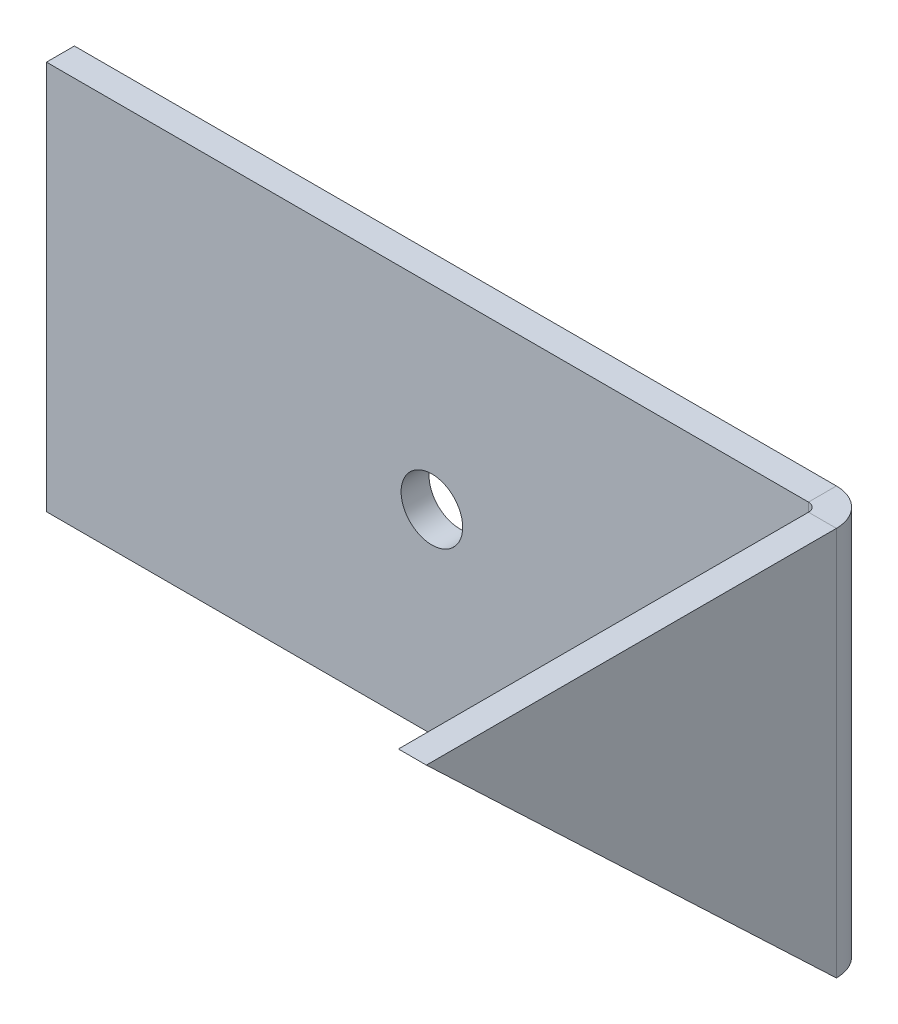
ISO-10303-21;
HEADER;
FILE_DESCRIPTION(('STEP AP214'),'2;1');
FILE_NAME('part.step','',(''),(''),'','','');
FILE_SCHEMA(('AUTOMOTIVE_DESIGN { 1 0 10303 214 1 1 1 1 }'));
ENDSEC;
DATA;
#1=APPLICATION_CONTEXT('core data for automotive mechanical design processes');
#2=APPLICATION_PROTOCOL_DEFINITION('international standard','automotive_design',2000,#1);
#3=PRODUCT_CONTEXT('',#1,'mechanical');
#4=PRODUCT('Part','Part','',(#3));
#5=PRODUCT_RELATED_PRODUCT_CATEGORY('part','',(#4));
#6=PRODUCT_DEFINITION_FORMATION('','',#4);
#7=PRODUCT_DEFINITION_CONTEXT('part definition',#1,'design');
#8=PRODUCT_DEFINITION('design','',#6,#7);
#9=PRODUCT_DEFINITION_SHAPE('','',#8);
#10=(LENGTH_UNIT() NAMED_UNIT(*) SI_UNIT(.MILLI.,.METRE.));
#11=(NAMED_UNIT(*) PLANE_ANGLE_UNIT() SI_UNIT($,.RADIAN.));
#12=(NAMED_UNIT(*) SI_UNIT($,.STERADIAN.) SOLID_ANGLE_UNIT());
#13=UNCERTAINTY_MEASURE_WITH_UNIT(LENGTH_MEASURE(1.E-05),#10,'distance_accuracy_value','');
#14=(GEOMETRIC_REPRESENTATION_CONTEXT(3) GLOBAL_UNCERTAINTY_ASSIGNED_CONTEXT((#13)) GLOBAL_UNIT_ASSIGNED_CONTEXT((#10,
#11,#12)) REPRESENTATION_CONTEXT('',''));
#15=CARTESIAN_POINT('',(0.,0.,0.));
#16=DIRECTION('',(0.,0.,1.));
#17=DIRECTION('',(1.,0.,0.));
#18=AXIS2_PLACEMENT_3D('',#15,#16,#17);
#19=CARTESIAN_POINT('',(0.,0.,3.175));
#20=DIRECTION('',(0.,0.,-1.));
#21=DIRECTION('',(-1.,0.,0.));
#22=AXIS2_PLACEMENT_3D('',#19,#20,#21);
#23=PLANE('',#22);
#24=CARTESIAN_POINT('',(0.,0.,3.175));
#25=DIRECTION('',(0.,0.,1.));
#26=DIRECTION('',(1.,0.,0.));
#27=AXIS2_PLACEMENT_3D('',#24,#25,#26);
#28=CIRCLE('',#27,3.49999999999999);
#29=CARTESIAN_POINT('',(3.49999999999999,0.,3.175));
#30=VERTEX_POINT('',#29);
#31=EDGE_CURVE('E198',#30,#30,#28,.T.);
#32=ORIENTED_EDGE('',*,*,#31,.F.);
#33=EDGE_LOOP('',(#32));
#34=FACE_BOUND('',#33,.T.);
#35=DIRECTION('',(0.,1.,0.));
#36=VECTOR('',#35,1.);
#37=CARTESIAN_POINT('',(42.82008,22.13737,3.17499999999999));
#38=LINE('',#37,#36);
#39=CARTESIAN_POINT('',(42.82008,22.13737,3.17499999999999));
#40=VERTEX_POINT('',#39);
#41=CARTESIAN_POINT('',(42.82008,-22.13737,3.17499999999999));
#42=VERTEX_POINT('',#41);
#43=EDGE_CURVE('E152',#40,#42,#38,.F.);
#44=ORIENTED_EDGE('',*,*,#43,.F.);
#45=DIRECTION('',(-1.,0.,0.));
#46=VECTOR('',#45,1.);
#47=CARTESIAN_POINT('',(-43.82008,22.13737,3.175));
#48=LINE('',#47,#46);
#49=CARTESIAN_POINT('',(-43.82008,22.13737,3.175));
#50=VERTEX_POINT('',#49);
#51=EDGE_CURVE('E159',#40,#50,#48,.T.);
#52=ORIENTED_EDGE('',*,*,#51,.T.);
#53=DIRECTION('',(0.,-1.,0.));
#54=VECTOR('',#53,1.);
#55=CARTESIAN_POINT('',(-43.82008,-22.13737,3.175));
#56=LINE('',#55,#54);
#57=CARTESIAN_POINT('',(-43.82008,-22.13737,3.175));
#58=VERTEX_POINT('',#57);
#59=EDGE_CURVE('E61',#50,#58,#56,.T.);
#60=ORIENTED_EDGE('',*,*,#59,.T.);
#61=DIRECTION('',(1.,0.,0.));
#62=VECTOR('',#61,1.);
#63=CARTESIAN_POINT('',(-43.82008,-22.13737,3.175));
#64=LINE('',#63,#62);
#65=EDGE_CURVE('E163',#58,#42,#64,.T.);
#66=ORIENTED_EDGE('',*,*,#65,.T.);
#67=EDGE_LOOP('',(#44,#52,#60,#66));
#68=FACE_BOUND('',#67,.T.);
#69=ADVANCED_FACE('F44',(#34,#68),#23,.F.);
#70=CARTESIAN_POINT('',(0.,0.,0.));
#71=DIRECTION('',(0.,0.,-1.));
#72=DIRECTION('',(-1.,0.,0.));
#73=AXIS2_PLACEMENT_3D('',#70,#71,#72);
#74=PLANE('',#73);
#75=CARTESIAN_POINT('',(0.,0.,0.));
#76=DIRECTION('',(0.,0.,1.));
#77=DIRECTION('',(1.,0.,0.));
#78=AXIS2_PLACEMENT_3D('',#75,#76,#77);
#79=CIRCLE('',#78,3.5);
#80=CARTESIAN_POINT('',(3.5,0.,0.));
#81=VERTEX_POINT('',#80);
#82=EDGE_CURVE('E130',#81,#81,#79,.T.);
#83=ORIENTED_EDGE('',*,*,#82,.T.);
#84=EDGE_LOOP('',(#83));
#85=FACE_BOUND('',#84,.T.);
#86=DIRECTION('',(-1.,0.,0.));
#87=VECTOR('',#86,1.);
#88=CARTESIAN_POINT('',(-43.82008,22.13737,0.));
#89=LINE('',#88,#87);
#90=CARTESIAN_POINT('',(42.82008,22.13737,0.));
#91=VERTEX_POINT('',#90);
#92=CARTESIAN_POINT('',(-43.82008,22.13737,0.));
#93=VERTEX_POINT('',#92);
#94=EDGE_CURVE('E72',#91,#93,#89,.T.);
#95=ORIENTED_EDGE('',*,*,#94,.F.);
#96=DIRECTION('',(0.,1.,0.));
#97=VECTOR('',#96,1.);
#98=CARTESIAN_POINT('',(42.82008,22.13737,0.));
#99=LINE('',#98,#97);
#100=CARTESIAN_POINT('',(42.82008,-22.13737,0.));
#101=VERTEX_POINT('',#100);
#102=EDGE_CURVE('E141',#91,#101,#99,.F.);
#103=ORIENTED_EDGE('',*,*,#102,.T.);
#104=DIRECTION('',(1.,0.,0.));
#105=VECTOR('',#104,1.);
#106=CARTESIAN_POINT('',(-43.82008,-22.13737,0.));
#107=LINE('',#106,#105);
#108=CARTESIAN_POINT('',(-43.82008,-22.13737,0.));
#109=VERTEX_POINT('',#108);
#110=EDGE_CURVE('E161',#109,#101,#107,.T.);
#111=ORIENTED_EDGE('',*,*,#110,.F.);
#112=DIRECTION('',(0.,-1.,0.));
#113=VECTOR('',#112,1.);
#114=CARTESIAN_POINT('',(-43.82008,-22.13737,0.));
#115=LINE('',#114,#113);
#116=EDGE_CURVE('E166',#93,#109,#115,.T.);
#117=ORIENTED_EDGE('',*,*,#116,.F.);
#118=EDGE_LOOP('',(#95,#103,#111,#117));
#119=FACE_BOUND('',#118,.T.);
#120=ADVANCED_FACE('F178',(#85,#119),#74,.T.);
#121=CARTESIAN_POINT('',(-43.82008,22.13737,3.175));
#122=DIRECTION('',(0.,-1.,0.));
#123=DIRECTION('',(0.,0.,-1.));
#124=AXIS2_PLACEMENT_3D('',#121,#122,#123);
#125=PLANE('',#124);
#126=DIRECTION('',(0.,0.,-1.));
#127=VECTOR('',#126,1.);
#128=CARTESIAN_POINT('',(42.82008,22.13737,3.17499999999999));
#129=LINE('',#128,#127);
#130=EDGE_CURVE('E146',#40,#91,#129,.T.);
#131=ORIENTED_EDGE('',*,*,#130,.T.);
#132=ORIENTED_EDGE('',*,*,#94,.T.);
#133=DIRECTION('',(0.,0.,-1.));
#134=VECTOR('',#133,1.);
#135=CARTESIAN_POINT('',(-43.82008,22.13737,3.175));
#136=LINE('',#135,#134);
#137=EDGE_CURVE('E11',#50,#93,#136,.T.);
#138=ORIENTED_EDGE('',*,*,#137,.F.);
#139=ORIENTED_EDGE('',*,*,#51,.F.);
#140=EDGE_LOOP('',(#131,#132,#138,#139));
#141=FACE_BOUND('',#140,.T.);
#142=ADVANCED_FACE('F46',(#141),#125,.F.);
#143=CARTESIAN_POINT('',(-43.82008,-22.13737,3.175));
#144=DIRECTION('',(0.,1.,0.));
#145=DIRECTION('',(0.,0.,1.));
#146=AXIS2_PLACEMENT_3D('',#143,#144,#145);
#147=PLANE('',#146);
#148=DIRECTION('',(0.,0.,-1.));
#149=VECTOR('',#148,1.);
#150=CARTESIAN_POINT('',(42.82008,-22.13737,3.17499999999999));
#151=LINE('',#150,#149);
#152=EDGE_CURVE('E156',#42,#101,#151,.T.);
#153=ORIENTED_EDGE('',*,*,#152,.F.);
#154=ORIENTED_EDGE('',*,*,#65,.F.);
#155=DIRECTION('',(0.,0.,-1.));
#156=VECTOR('',#155,1.);
#157=CARTESIAN_POINT('',(-43.82008,-22.13737,3.175));
#158=LINE('',#157,#156);
#159=EDGE_CURVE('E53',#58,#109,#158,.T.);
#160=ORIENTED_EDGE('',*,*,#159,.T.);
#161=ORIENTED_EDGE('',*,*,#110,.T.);
#162=EDGE_LOOP('',(#153,#154,#160,#161));
#163=FACE_BOUND('',#162,.T.);
#164=ADVANCED_FACE('F174',(#163),#147,.F.);
#165=CARTESIAN_POINT('',(-43.82008,-22.13737,3.175));
#166=DIRECTION('',(1.,0.,0.));
#167=DIRECTION('',(0.,0.,-1.));
#168=AXIS2_PLACEMENT_3D('',#165,#166,#167);
#169=PLANE('',#168);
#170=ORIENTED_EDGE('',*,*,#116,.T.);
#171=ORIENTED_EDGE('',*,*,#159,.F.);
#172=ORIENTED_EDGE('',*,*,#59,.F.);
#173=ORIENTED_EDGE('',*,*,#137,.T.);
#174=EDGE_LOOP('',(#170,#171,#172,#173));
#175=FACE_BOUND('',#174,.T.);
#176=ADVANCED_FACE('F216',(#175),#169,.F.);
#177=CARTESIAN_POINT('',(42.82008,-22.13737,4.17499999999999));
#178=DIRECTION('',(0.,-1.,0.));
#179=DIRECTION('',(0.,0.,-1.));
#180=AXIS2_PLACEMENT_3D('',#177,#178,#179);
#181=PLANE('',#180);
#182=DIRECTION('',(1.,0.,0.));
#183=VECTOR('',#182,1.);
#184=CARTESIAN_POINT('',(43.82008,-22.13737,4.17499999999999));
#185=LINE('',#184,#183);
#186=CARTESIAN_POINT('',(43.82008,-22.13737,4.17499999999999));
#187=VERTEX_POINT('',#186);
#188=CARTESIAN_POINT('',(46.9950800000001,-22.13737,4.17499999999998));
#189=VERTEX_POINT('',#188);
#190=EDGE_CURVE('E190',#187,#189,#185,.T.);
#191=ORIENTED_EDGE('',*,*,#190,.F.);
#192=CARTESIAN_POINT('',(42.82008,-22.13737,4.17499999999999));
#193=DIRECTION('',(0.,1.,0.));
#194=DIRECTION('',(0.,0.,1.));
#195=AXIS2_PLACEMENT_3D('',#192,#193,#194);
#196=CIRCLE('',#195,1.);
#197=EDGE_CURVE('E149',#42,#187,#196,.F.);
#198=ORIENTED_EDGE('',*,*,#197,.F.);
#199=ORIENTED_EDGE('',*,*,#152,.T.);
#200=CARTESIAN_POINT('',(42.82008,-22.13737,4.17499999999999));
#201=DIRECTION('',(0.,1.,0.));
#202=DIRECTION('',(0.,0.,1.));
#203=AXIS2_PLACEMENT_3D('',#200,#201,#202);
#204=CIRCLE('',#203,4.175);
#205=EDGE_CURVE('E80',#101,#189,#204,.F.);
#206=ORIENTED_EDGE('',*,*,#205,.T.);
#207=EDGE_LOOP('',(#191,#198,#199,#206));
#208=FACE_BOUND('',#207,.T.);
#209=ADVANCED_FACE('F189',(#208),#181,.T.);
#210=CARTESIAN_POINT('',(42.82008,22.13737,4.17499999999999));
#211=DIRECTION('',(0.,-1.,0.));
#212=DIRECTION('',(0.,0.,-1.));
#213=AXIS2_PLACEMENT_3D('',#210,#211,#212);
#214=PLANE('',#213);
#215=CARTESIAN_POINT('',(42.82008,22.13737,4.17499999999999));
#216=DIRECTION('',(0.,1.,0.));
#217=DIRECTION('',(0.,0.,1.));
#218=AXIS2_PLACEMENT_3D('',#215,#216,#217);
#219=CIRCLE('',#218,1.);
#220=CARTESIAN_POINT('',(43.82008,22.13737,4.17499999999999));
#221=VERTEX_POINT('',#220);
#222=EDGE_CURVE('E120',#221,#40,#219,.T.);
#223=ORIENTED_EDGE('',*,*,#222,.F.);
#224=DIRECTION('',(1.,0.,0.));
#225=VECTOR('',#224,1.);
#226=CARTESIAN_POINT('',(43.82008,22.13737,4.17499999999999));
#227=LINE('',#226,#225);
#228=CARTESIAN_POINT('',(46.99508,22.13737,4.17499999999998));
#229=VERTEX_POINT('',#228);
#230=EDGE_CURVE('E134',#221,#229,#227,.T.);
#231=ORIENTED_EDGE('',*,*,#230,.T.);
#232=CARTESIAN_POINT('',(42.82008,22.13737,4.17499999999999));
#233=DIRECTION('',(0.,1.,0.));
#234=DIRECTION('',(0.,0.,1.));
#235=AXIS2_PLACEMENT_3D('',#232,#233,#234);
#236=CIRCLE('',#235,4.175);
#237=EDGE_CURVE('E144',#229,#91,#236,.T.);
#238=ORIENTED_EDGE('',*,*,#237,.T.);
#239=ORIENTED_EDGE('',*,*,#130,.F.);
#240=EDGE_LOOP('',(#223,#231,#238,#239));
#241=FACE_BOUND('',#240,.T.);
#242=ADVANCED_FACE('F182',(#241),#214,.F.);
#243=CARTESIAN_POINT('',(42.82008,22.13737,4.17499999999999));
#244=DIRECTION('',(0.,1.,0.));
#245=DIRECTION('',(1.,0.,0.));
#246=AXIS2_PLACEMENT_3D('',#243,#244,#245);
#247=CYLINDRICAL_SURFACE('',#246,4.175);
#248=ORIENTED_EDGE('',*,*,#102,.F.);
#249=ORIENTED_EDGE('',*,*,#237,.F.);
#250=DIRECTION('',(0.,1.,0.));
#251=VECTOR('',#250,1.);
#252=CARTESIAN_POINT('',(46.99508,0.,4.17499999999998));
#253=LINE('',#252,#251);
#254=EDGE_CURVE('E135',#189,#229,#253,.T.);
#255=ORIENTED_EDGE('',*,*,#254,.F.);
#256=ORIENTED_EDGE('',*,*,#205,.F.);
#257=EDGE_LOOP('',(#248,#249,#255,#256));
#258=FACE_BOUND('',#257,.T.);
#259=ADVANCED_FACE('F179',(#258),#247,.T.);
#260=CARTESIAN_POINT('',(42.82008,22.13737,4.17499999999999));
#261=DIRECTION('',(0.,1.,0.));
#262=DIRECTION('',(1.,0.,0.));
#263=AXIS2_PLACEMENT_3D('',#260,#261,#262);
#264=CYLINDRICAL_SURFACE('',#263,1.);
#265=ORIENTED_EDGE('',*,*,#43,.T.);
#266=ORIENTED_EDGE('',*,*,#197,.T.);
#267=DIRECTION('',(0.,1.,0.));
#268=VECTOR('',#267,1.);
#269=CARTESIAN_POINT('',(43.82008,-22.13737,4.17499999999999));
#270=LINE('',#269,#268);
#271=EDGE_CURVE('E129',#187,#221,#270,.T.);
#272=ORIENTED_EDGE('',*,*,#271,.T.);
#273=ORIENTED_EDGE('',*,*,#222,.T.);
#274=EDGE_LOOP('',(#265,#266,#272,#273));
#275=FACE_BOUND('',#274,.T.);
#276=ADVANCED_FACE('F187',(#275),#264,.F.);
#277=CARTESIAN_POINT('',(46.99508,22.13737,3.17499999999999));
#278=DIRECTION('',(0.,1.,0.));
#279=DIRECTION('',(0.,0.,1.));
#280=AXIS2_PLACEMENT_3D('',#277,#278,#279);
#281=PLANE('',#280);
#282=DIRECTION('',(0.,0.,-1.));
#283=VECTOR('',#282,1.);
#284=CARTESIAN_POINT('',(46.99508,22.13737,3.17499999999999));
#285=LINE('',#284,#283);
#286=CARTESIAN_POINT('',(46.9950800000001,22.13737,50.8));
#287=VERTEX_POINT('',#286);
#288=EDGE_CURVE('E121',#287,#229,#285,.T.);
#289=ORIENTED_EDGE('',*,*,#288,.T.);
#290=ORIENTED_EDGE('',*,*,#230,.F.);
#291=DIRECTION('',(0.,0.,-1.));
#292=VECTOR('',#291,1.);
#293=CARTESIAN_POINT('',(43.82008,22.13737,3.175));
#294=LINE('',#293,#292);
#295=CARTESIAN_POINT('',(43.8200800000001,22.13737,50.8));
#296=VERTEX_POINT('',#295);
#297=EDGE_CURVE('E127',#296,#221,#294,.T.);
#298=ORIENTED_EDGE('',*,*,#297,.F.);
#299=DIRECTION('',(-1.,0.,0.));
#300=VECTOR('',#299,1.);
#301=CARTESIAN_POINT('',(46.9950800000001,22.13737,50.8));
#302=LINE('',#301,#300);
#303=EDGE_CURVE('E109',#287,#296,#302,.T.);
#304=ORIENTED_EDGE('',*,*,#303,.F.);
#305=EDGE_LOOP('',(#289,#290,#298,#304));
#306=FACE_BOUND('',#305,.T.);
#307=ADVANCED_FACE('F132',(#306),#281,.T.);
#308=CARTESIAN_POINT('',(46.99508,0.,-1.64313994217492E-13));
#309=DIRECTION('',(1.,0.,0.));
#310=DIRECTION('',(0.,0.,-1.));
#311=AXIS2_PLACEMENT_3D('',#308,#309,#310);
#312=PLANE('',#311);
#313=DIRECTION('',(0.,0.688594041197589,0.725147051588278));
#314=VECTOR('',#313,1.);
#315=CARTESIAN_POINT('',(46.99508,-13.7253866654476,13.033521201333));
#316=LINE('',#315,#314);
#317=EDGE_CURVE('E115',#189,#287,#316,.T.);
#318=ORIENTED_EDGE('',*,*,#317,.F.);
#319=ORIENTED_EDGE('',*,*,#254,.T.);
#320=ORIENTED_EDGE('',*,*,#288,.F.);
#321=EDGE_LOOP('',(#318,#319,#320));
#322=FACE_BOUND('',#321,.T.);
#323=ADVANCED_FACE('F232',(#322),#312,.T.);
#324=CARTESIAN_POINT('',(43.82008,0.,-1.53228540966665E-13));
#325=DIRECTION('',(1.,0.,0.));
#326=DIRECTION('',(0.,0.,-1.));
#327=AXIS2_PLACEMENT_3D('',#324,#325,#326);
#328=PLANE('',#327);
#329=ORIENTED_EDGE('',*,*,#271,.F.);
#330=DIRECTION('',(0.,-0.688594041197589,-0.725147051588278));
#331=VECTOR('',#330,1.);
#332=CARTESIAN_POINT('',(43.82008,-13.7253866654476,13.033521201333));
#333=LINE('',#332,#331);
#334=EDGE_CURVE('E112',#296,#187,#333,.T.);
#335=ORIENTED_EDGE('',*,*,#334,.F.);
#336=ORIENTED_EDGE('',*,*,#297,.T.);
#337=EDGE_LOOP('',(#329,#335,#336));
#338=FACE_BOUND('',#337,.T.);
#339=ADVANCED_FACE('F126',(#338),#328,.F.);
#340=CARTESIAN_POINT('',(46.995092,-13.7253866654476,13.033521201333));
#341=DIRECTION('',(0.,0.725147051588278,-0.688594041197589));
#342=DIRECTION('',(0.,0.688594041197589,0.725147051588278));
#343=AXIS2_PLACEMENT_3D('',#340,#341,#342);
#344=PLANE('',#343);
#345=ORIENTED_EDGE('',*,*,#317,.T.);
#346=ORIENTED_EDGE('',*,*,#303,.T.);
#347=ORIENTED_EDGE('',*,*,#334,.T.);
#348=ORIENTED_EDGE('',*,*,#190,.T.);
#349=EDGE_LOOP('',(#345,#346,#347,#348));
#350=FACE_BOUND('',#349,.T.);
#351=ADVANCED_FACE('F111',(#350),#344,.F.);
#352=CARTESIAN_POINT('',(0.,0.,3.175));
#353=DIRECTION('',(0.,0.,1.));
#354=DIRECTION('',(1.,0.,0.));
#355=AXIS2_PLACEMENT_3D('',#352,#353,#354);
#356=CYLINDRICAL_SURFACE('',#355,3.49999999999999);
#357=ORIENTED_EDGE('',*,*,#82,.F.);
#358=EDGE_LOOP('',(#357));
#359=FACE_BOUND('',#358,.T.);
#360=ORIENTED_EDGE('',*,*,#31,.T.);
#361=EDGE_LOOP('',(#360));
#362=FACE_BOUND('',#361,.T.);
#363=ADVANCED_FACE('F202',(#359,#362),#356,.F.);
#364=CLOSED_SHELL('',(#69,#120,#142,#164,#176,#209,#242,#259,#276,#307,#323,#339,#351,#363));
#365=MANIFOLD_SOLID_BREP('B2',#364);
#366=ADVANCED_BREP_SHAPE_REPRESENTATION('',(#18,#365),#14);
#367=SHAPE_DEFINITION_REPRESENTATION(#9,#366);
ENDSEC;
END-ISO-10303-21;
